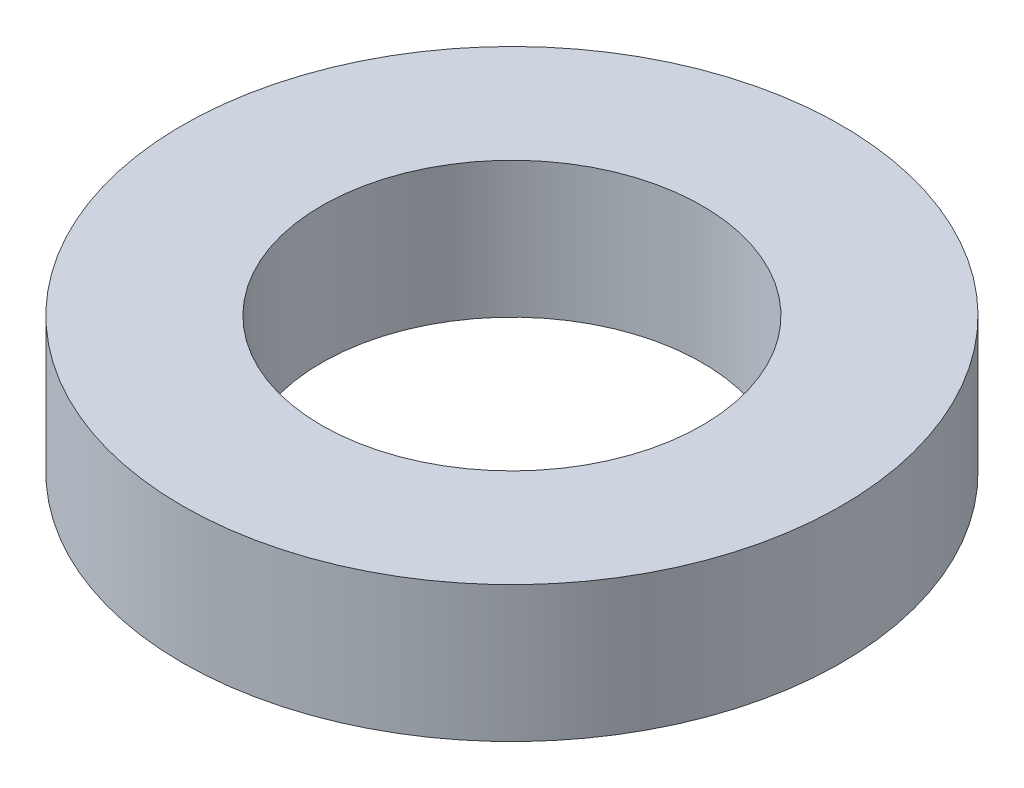
ISO-10303-21;
HEADER;
FILE_DESCRIPTION(('STEP AP214'),'2;1');
FILE_NAME('part.step','',(''),(''),'','','');
FILE_SCHEMA(('AUTOMOTIVE_DESIGN { 1 0 10303 214 1 1 1 1 }'));
ENDSEC;
DATA;
#1=APPLICATION_CONTEXT('core data for automotive mechanical design processes');
#2=APPLICATION_PROTOCOL_DEFINITION('international standard','automotive_design',2000,#1);
#3=PRODUCT_CONTEXT('',#1,'mechanical');
#4=PRODUCT('Part','Part','',(#3));
#5=PRODUCT_RELATED_PRODUCT_CATEGORY('part','',(#4));
#6=PRODUCT_DEFINITION_FORMATION('','',#4);
#7=PRODUCT_DEFINITION_CONTEXT('part definition',#1,'design');
#8=PRODUCT_DEFINITION('design','',#6,#7);
#9=PRODUCT_DEFINITION_SHAPE('','',#8);
#10=(LENGTH_UNIT() NAMED_UNIT(*) SI_UNIT(.MILLI.,.METRE.));
#11=(NAMED_UNIT(*) PLANE_ANGLE_UNIT() SI_UNIT($,.RADIAN.));
#12=(NAMED_UNIT(*) SI_UNIT($,.STERADIAN.) SOLID_ANGLE_UNIT());
#13=UNCERTAINTY_MEASURE_WITH_UNIT(LENGTH_MEASURE(1.E-05),#10,'distance_accuracy_value','');
#14=(GEOMETRIC_REPRESENTATION_CONTEXT(3) GLOBAL_UNCERTAINTY_ASSIGNED_CONTEXT((#13)) GLOBAL_UNIT_ASSIGNED_CONTEXT((#10,
#11,#12)) REPRESENTATION_CONTEXT('',''));
#15=CARTESIAN_POINT('',(0.,0.,0.));
#16=DIRECTION('',(0.,0.,1.));
#17=DIRECTION('',(1.,0.,0.));
#18=AXIS2_PLACEMENT_3D('',#15,#16,#17);
#19=CARTESIAN_POINT('',(0.,1.,0.));
#20=DIRECTION('',(0.,1.,0.));
#21=DIRECTION('',(0.,0.,1.));
#22=AXIS2_PLACEMENT_3D('',#19,#20,#21);
#23=PLANE('',#22);
#24=CARTESIAN_POINT('',(0.,1.,0.));
#25=DIRECTION('',(0.,1.,0.));
#26=DIRECTION('',(0.,0.,1.));
#27=AXIS2_PLACEMENT_3D('',#24,#25,#26);
#28=CIRCLE('',#27,4.85);
#29=CARTESIAN_POINT('',(0.,1.,4.85));
#30=VERTEX_POINT('',#29);
#31=EDGE_CURVE('E10',#30,#30,#28,.T.);
#32=ORIENTED_EDGE('',*,*,#31,.T.);
#33=EDGE_LOOP('',(#32));
#34=FACE_BOUND('',#33,.T.);
#35=CARTESIAN_POINT('',(0.,1.,0.));
#36=DIRECTION('',(0.,1.,0.));
#37=DIRECTION('',(0.,0.,1.));
#38=AXIS2_PLACEMENT_3D('',#35,#36,#37);
#39=CIRCLE('',#38,2.8);
#40=CARTESIAN_POINT('',(0.,1.,2.8));
#41=VERTEX_POINT('',#40);
#42=EDGE_CURVE('E55',#41,#41,#39,.T.);
#43=ORIENTED_EDGE('',*,*,#42,.F.);
#44=EDGE_LOOP('',(#43));
#45=FACE_BOUND('',#44,.T.);
#46=ADVANCED_FACE('F41',(#34,#45),#23,.T.);
#47=CARTESIAN_POINT('',(0.,-1.,0.));
#48=DIRECTION('',(0.,1.,0.));
#49=DIRECTION('',(0.,0.,1.));
#50=AXIS2_PLACEMENT_3D('',#47,#48,#49);
#51=PLANE('',#50);
#52=CARTESIAN_POINT('',(0.,-1.,0.));
#53=DIRECTION('',(0.,1.,0.));
#54=DIRECTION('',(0.,0.,1.));
#55=AXIS2_PLACEMENT_3D('',#52,#53,#54);
#56=CIRCLE('',#55,4.85);
#57=CARTESIAN_POINT('',(0.,-1.,4.85));
#58=VERTEX_POINT('',#57);
#59=EDGE_CURVE('E44',#58,#58,#56,.T.);
#60=ORIENTED_EDGE('',*,*,#59,.F.);
#61=EDGE_LOOP('',(#60));
#62=FACE_BOUND('',#61,.T.);
#63=CARTESIAN_POINT('',(0.,-1.,0.));
#64=DIRECTION('',(0.,1.,0.));
#65=DIRECTION('',(0.,0.,1.));
#66=AXIS2_PLACEMENT_3D('',#63,#64,#65);
#67=CIRCLE('',#66,2.8);
#68=CARTESIAN_POINT('',(0.,-1.,2.8));
#69=VERTEX_POINT('',#68);
#70=EDGE_CURVE('E53',#69,#69,#67,.T.);
#71=ORIENTED_EDGE('',*,*,#70,.T.);
#72=EDGE_LOOP('',(#71));
#73=FACE_BOUND('',#72,.T.);
#74=ADVANCED_FACE('F63',(#62,#73),#51,.F.);
#75=CARTESIAN_POINT('',(0.,1.,0.));
#76=DIRECTION('',(0.,-1.,0.));
#77=DIRECTION('',(0.,0.,-1.));
#78=AXIS2_PLACEMENT_3D('',#75,#76,#77);
#79=CYLINDRICAL_SURFACE('',#78,4.85);
#80=ORIENTED_EDGE('',*,*,#31,.F.);
#81=EDGE_LOOP('',(#80));
#82=FACE_BOUND('',#81,.T.);
#83=ORIENTED_EDGE('',*,*,#59,.T.);
#84=EDGE_LOOP('',(#83));
#85=FACE_BOUND('',#84,.T.);
#86=ADVANCED_FACE('F43',(#82,#85),#79,.T.);
#87=CARTESIAN_POINT('',(0.,1.,0.));
#88=DIRECTION('',(0.,-1.,0.));
#89=DIRECTION('',(0.,0.,-1.));
#90=AXIS2_PLACEMENT_3D('',#87,#88,#89);
#91=CYLINDRICAL_SURFACE('',#90,2.8);
#92=ORIENTED_EDGE('',*,*,#42,.T.);
#93=EDGE_LOOP('',(#92));
#94=FACE_BOUND('',#93,.T.);
#95=ORIENTED_EDGE('',*,*,#70,.F.);
#96=EDGE_LOOP('',(#95));
#97=FACE_BOUND('',#96,.T.);
#98=ADVANCED_FACE('F58',(#94,#97),#91,.F.);
#99=CLOSED_SHELL('',(#46,#74,#86,#98));
#100=MANIFOLD_SOLID_BREP('B2',#99);
#101=ADVANCED_BREP_SHAPE_REPRESENTATION('',(#18,#100),#14);
#102=SHAPE_DEFINITION_REPRESENTATION(#9,#101);
ENDSEC;
END-ISO-10303-21;
